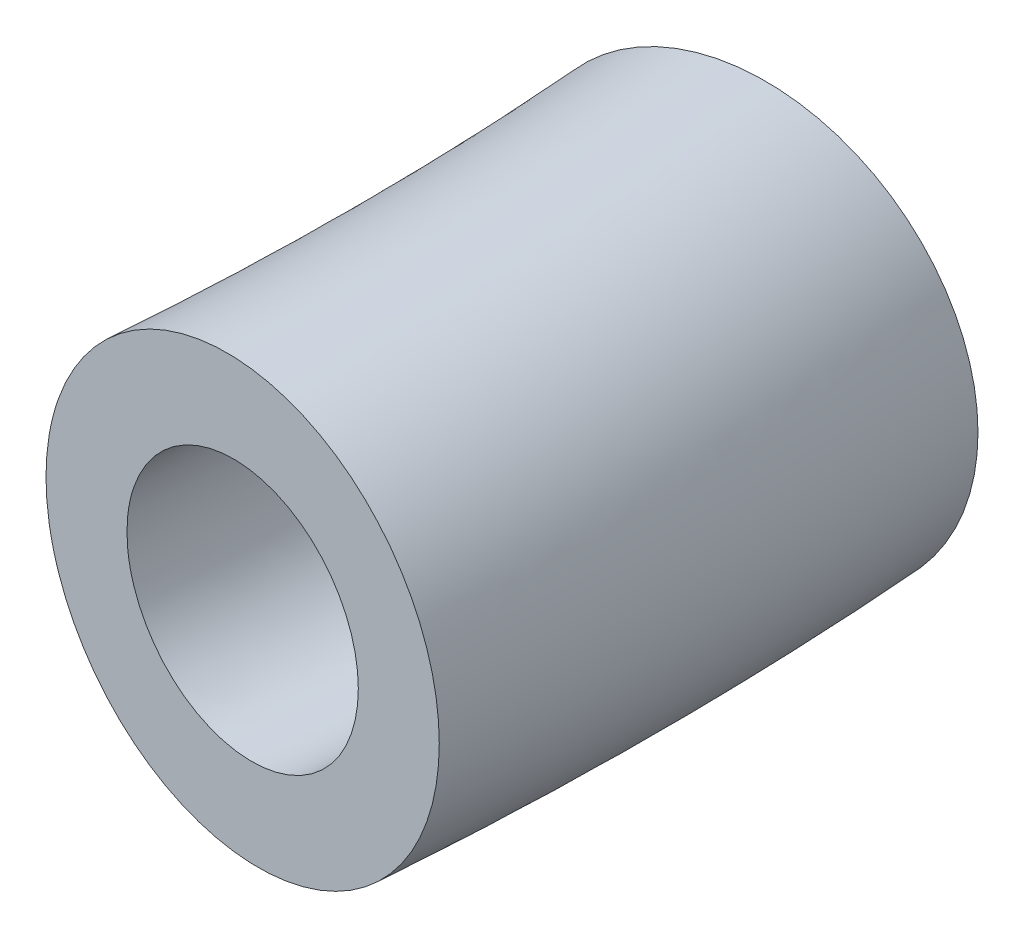
ISO-10303-21;
HEADER;
FILE_DESCRIPTION(('STEP AP214'),'2;1');
FILE_NAME('part.step','',(''),(''),'','','');
FILE_SCHEMA(('AUTOMOTIVE_DESIGN { 1 0 10303 214 1 1 1 1 }'));
ENDSEC;
DATA;
#1=APPLICATION_CONTEXT('core data for automotive mechanical design processes');
#2=APPLICATION_PROTOCOL_DEFINITION('international standard','automotive_design',2000,#1);
#3=PRODUCT_CONTEXT('',#1,'mechanical');
#4=PRODUCT('Part','Part','',(#3));
#5=PRODUCT_RELATED_PRODUCT_CATEGORY('part','',(#4));
#6=PRODUCT_DEFINITION_FORMATION('','',#4);
#7=PRODUCT_DEFINITION_CONTEXT('part definition',#1,'design');
#8=PRODUCT_DEFINITION('design','',#6,#7);
#9=PRODUCT_DEFINITION_SHAPE('','',#8);
#10=(LENGTH_UNIT() NAMED_UNIT(*) SI_UNIT(.MILLI.,.METRE.));
#11=(NAMED_UNIT(*) PLANE_ANGLE_UNIT() SI_UNIT($,.RADIAN.));
#12=(NAMED_UNIT(*) SI_UNIT($,.STERADIAN.) SOLID_ANGLE_UNIT());
#13=UNCERTAINTY_MEASURE_WITH_UNIT(LENGTH_MEASURE(1.E-05),#10,'distance_accuracy_value','');
#14=(GEOMETRIC_REPRESENTATION_CONTEXT(3) GLOBAL_UNCERTAINTY_ASSIGNED_CONTEXT((#13)) GLOBAL_UNIT_ASSIGNED_CONTEXT((#10,
#11,#12)) REPRESENTATION_CONTEXT('',''));
#15=CARTESIAN_POINT('',(0.,0.,0.));
#16=DIRECTION('',(0.,0.,1.));
#17=DIRECTION('',(1.,0.,0.));
#18=AXIS2_PLACEMENT_3D('',#15,#16,#17);
#19=CARTESIAN_POINT('',(40.3646493377853,0.,53.3891719470228));
#20=CARTESIAN_POINT('',(41.7877858495926,0.,35.5999655524769));
#21=CARTESIAN_POINT('',(42.5,0.,17.8000000000043));
#22=CARTESIAN_POINT('',(42.5,0.,-17.8000000000043));
#23=CARTESIAN_POINT('',(41.7877858493677,0.,-35.5999655522717));
#24=CARTESIAN_POINT('',(40.3646493377853,0.,-53.3891719470228));
#25=CARTESIAN_POINT('',(40.3646493377853,85.,53.3891719470228));
#26=CARTESIAN_POINT('',(41.7877858495926,85.,35.5999655524769));
#27=CARTESIAN_POINT('',(42.5,85.,17.8000000000043));
#28=CARTESIAN_POINT('',(42.5,85.,-17.8000000000043));
#29=CARTESIAN_POINT('',(41.7877858493677,85.,-35.5999655522717));
#30=CARTESIAN_POINT('',(40.3646493377853,85.,-53.3891719470228));
#31=CARTESIAN_POINT('',(-44.3646493377853,85.,46.6108280529772));
#32=CARTESIAN_POINT('',(-43.1211191826822,85.,31.0667011148847));
#33=CARTESIAN_POINT('',(-42.5,85.,15.5333333333406));
#34=CARTESIAN_POINT('',(-42.5,85.,-15.5333333333406));
#35=CARTESIAN_POINT('',(-43.121119182908,85.,-31.0667011144878));
#36=CARTESIAN_POINT('',(-44.3646493377853,85.,-46.6108280529772));
#37=CARTESIAN_POINT('',(-44.3646493377853,0.,46.6108280529772));
#38=CARTESIAN_POINT('',(-43.1211191826822,0.,31.0667011147977));
#39=CARTESIAN_POINT('',(-42.5,0.,15.5333333333406));
#40=CARTESIAN_POINT('',(-42.5,0.,-15.5333333333406));
#41=CARTESIAN_POINT('',(-43.121119182908,0.,-31.0667011144878));
#42=CARTESIAN_POINT('',(-44.3646493377853,0.,-46.6108280529772));
#43=CARTESIAN_POINT('',(-44.3646493377853,-85.,46.6108280529772));
#44=CARTESIAN_POINT('',(-43.1211191826822,-85.,31.0667011147107));
#45=CARTESIAN_POINT('',(-42.5,-85.,15.5333333333406));
#46=CARTESIAN_POINT('',(-42.5,-85.,-15.5333333333406));
#47=CARTESIAN_POINT('',(-43.121119182908,-85.,-31.0667011144878));
#48=CARTESIAN_POINT('',(-44.3646493377853,-85.,-46.6108280529772));
#49=CARTESIAN_POINT('',(40.3646493377853,-85.,53.3891719470228));
#50=CARTESIAN_POINT('',(41.7877858495926,-85.,35.5999655524769));
#51=CARTESIAN_POINT('',(42.5,-85.,17.8000000000043));
#52=CARTESIAN_POINT('',(42.5,-85.,-17.8000000000043));
#53=CARTESIAN_POINT('',(41.7877858493677,-85.,-35.5999655522717));
#54=CARTESIAN_POINT('',(40.3646493377853,-85.,-53.3891719470228));
#55=CARTESIAN_POINT('',(40.3646493377853,0.,53.3891719470228));
#56=CARTESIAN_POINT('',(41.7877858495926,0.,35.5999655524769));
#57=CARTESIAN_POINT('',(42.5,0.,17.8000000000043));
#58=CARTESIAN_POINT('',(42.5,0.,-17.8000000000043));
#59=CARTESIAN_POINT('',(41.7877858493677,0.,-35.5999655522717));
#60=CARTESIAN_POINT('',(40.3646493377853,0.,-53.3891719470228));
#61=(BOUNDED_SURFACE() B_SPLINE_SURFACE(3,3,((#19,#20,#21,#22,#23,#24),(#25,#26,#27,#28,#29,
#30),(#31,#32,#33,#34,#35,#36),(#37,#38,#39,#40,#41,#42),(#43,#44,#45,#46,#47,#48),(#49,#50,#51,
#52,#53,#54),(#55,#56,#57,#58,#59,#60)),.UNSPECIFIED.,.T.,.F.,
.F.) B_SPLINE_SURFACE_WITH_KNOTS((4,3,4),(4,2,4),(0.,0.5,1.),(0.,0.5,1.),
.UNSPECIFIED.) GEOMETRIC_REPRESENTATION_ITEM() RATIONAL_B_SPLINE_SURFACE(((1.,1.,1.,1.,1.,1.),
(0.333333333333333,0.333333333333333,0.333333333333333,0.333333333333333,0.333333333333333,
0.333333333333333),(0.333333333333333,0.333333333333333,0.333333333333333,0.333333333333333,
0.333333333333333,0.333333333333333),(1.,1.,1.,1.,1.,1.),(0.333333333333333,0.333333333333333,
0.333333333333333,0.333333333333333,0.333333333333333,0.333333333333333),(0.333333333333333,
0.333333333333333,0.333333333333333,0.333333333333333,0.333333333333333,0.333333333333333),(1.,
1.,1.,1.,1.,1.))) REPRESENTATION_ITEM('') SURFACE());
#62=CARTESIAN_POINT('',(-2.,0.,-50.));
#63=DIRECTION('',(0.0797452222828898,0.,0.996815278536125));
#64=DIRECTION('',(0.996815278536125,0.,-0.0797452222828898));
#65=AXIS2_PLACEMENT_3D('',#62,#63,#64);
#66=CIRCLE('',#65,42.5);
#67=CARTESIAN_POINT('',(40.3646493377853,0.,-53.3891719470228));
#68=VERTEX_POINT('',#67);
#69=EDGE_CURVE('E52',#68,#68,#66,.T.);
#70=CARTESIAN_POINT('',(-1.99999999999999,0.,50.));
#71=DIRECTION('',(-0.0797452222828898,0.,0.996815278536125));
#72=DIRECTION('',(0.996815278536125,0.,0.0797452222828898));
#73=AXIS2_PLACEMENT_3D('',#70,#71,#72);
#74=CIRCLE('',#73,42.5);
#75=CARTESIAN_POINT('',(40.3646493377853,0.,53.3891719470228));
#76=VERTEX_POINT('',#75);
#77=EDGE_CURVE('E37',#76,#76,#74,.T.);
#78=ORIENTED_EDGE('',*,*,#69,.T.);
#79=EDGE_LOOP('',(#78));
#80=FACE_BOUND('',#79,.T.);
#81=ORIENTED_EDGE('',*,*,#77,.F.);
#82=EDGE_LOOP('',(#81));
#83=FACE_BOUND('',#82,.T.);
#84=ADVANCED_FACE('F32',(#80,#83),#61,.F.);
#85=CARTESIAN_POINT('',(-1.99999999999999,0.,50.));
#86=DIRECTION('',(-0.0797452222828898,0.,0.996815278536125));
#87=DIRECTION('',(0.996815278536125,0.,0.0797452222828898));
#88=AXIS2_PLACEMENT_3D('',#85,#86,#87);
#89=PLANE('',#88);
#90=CARTESIAN_POINT('',(-1.99999999999999,0.,50.));
#91=DIRECTION('',(-0.0797452222828898,0.,0.996815278536125));
#92=DIRECTION('',(0.996815278536125,0.,0.0797452222828898));
#93=AXIS2_PLACEMENT_3D('',#90,#91,#92);
#94=CIRCLE('',#93,25.);
#95=CARTESIAN_POINT('',(22.9203819634031,0.,51.9936305570723));
#96=VERTEX_POINT('',#95);
#97=EDGE_CURVE('E42',#96,#96,#94,.F.);
#98=ORIENTED_EDGE('',*,*,#97,.T.);
#99=EDGE_LOOP('',(#98));
#100=FACE_BOUND('',#99,.T.);
#101=ORIENTED_EDGE('',*,*,#77,.T.);
#102=EDGE_LOOP('',(#101));
#103=FACE_BOUND('',#102,.T.);
#104=ADVANCED_FACE('F64',(#100,#103),#89,.T.);
#105=CARTESIAN_POINT('',(-2.,0.,-50.));
#106=DIRECTION('',(0.0797452222828898,0.,0.996815278536125));
#107=DIRECTION('',(0.996815278536125,0.,-0.0797452222828898));
#108=AXIS2_PLACEMENT_3D('',#105,#106,#107);
#109=PLANE('',#108);
#110=CARTESIAN_POINT('',(-2.,0.,-50.));
#111=DIRECTION('',(0.0797452222828898,0.,0.996815278536125));
#112=DIRECTION('',(0.996815278536125,0.,-0.0797452222828898));
#113=AXIS2_PLACEMENT_3D('',#110,#111,#112);
#114=CIRCLE('',#113,25.);
#115=CARTESIAN_POINT('',(22.9203819634031,0.,-51.9936305570723));
#116=VERTEX_POINT('',#115);
#117=EDGE_CURVE('E11',#116,#116,#114,.F.);
#118=ORIENTED_EDGE('',*,*,#117,.F.);
#119=EDGE_LOOP('',(#118));
#120=FACE_BOUND('',#119,.T.);
#121=ORIENTED_EDGE('',*,*,#69,.F.);
#122=EDGE_LOOP('',(#121));
#123=FACE_BOUND('',#122,.T.);
#124=ADVANCED_FACE('F62',(#120,#123),#109,.F.);
#125=CARTESIAN_POINT('',(22.9203819634031,0.,51.9936305570723));
#126=CARTESIAN_POINT('',(24.3065406956638,0.,34.6666464034952));
#127=CARTESIAN_POINT('',(25.,0.,17.3333333333383));
#128=CARTESIAN_POINT('',(25.,0.,-17.3333333333383));
#129=CARTESIAN_POINT('',(24.3065406956707,0.,-34.6666464032343));
#130=CARTESIAN_POINT('',(22.9203819634031,0.,-51.9936305570723));
#131=CARTESIAN_POINT('',(22.9203819634031,-50.,51.9936305570723));
#132=CARTESIAN_POINT('',(24.3065406956638,-50.,34.6666464034952));
#133=CARTESIAN_POINT('',(25.,-50.,17.3333333333383));
#134=CARTESIAN_POINT('',(25.,-50.,-17.3333333333383));
#135=CARTESIAN_POINT('',(24.3065406956707,-50.,-34.6666464032343));
#136=CARTESIAN_POINT('',(22.9203819634031,-50.,-51.9936305570723));
#137=CARTESIAN_POINT('',(-26.9203819634031,-50.,48.0063694429278));
#138=CARTESIAN_POINT('',(-25.6398740289854,-50.,32.0000202637794));
#139=CARTESIAN_POINT('',(-25.,-50.,16.0000000000066));
#140=CARTESIAN_POINT('',(-25.,-50.,-16.0000000000066));
#141=CARTESIAN_POINT('',(-25.639874028979,-50.,-32.0000202635252));
#142=CARTESIAN_POINT('',(-26.9203819634031,-50.,-48.0063694429278));
#143=CARTESIAN_POINT('',(-26.9203819634031,0.,48.0063694429278));
#144=CARTESIAN_POINT('',(-25.6398740289854,0.,32.0000202637794));
#145=CARTESIAN_POINT('',(-25.,0.,16.0000000000066));
#146=CARTESIAN_POINT('',(-25.,0.,-16.0000000000066));
#147=CARTESIAN_POINT('',(-25.639874028979,0.,-32.0000202635252));
#148=CARTESIAN_POINT('',(-26.9203819634031,0.,-48.0063694429278));
#149=CARTESIAN_POINT('',(-26.9203819634031,50.,48.0063694429278));
#150=CARTESIAN_POINT('',(-25.6398740289854,50.,32.0000202637794));
#151=CARTESIAN_POINT('',(-25.,50.,16.0000000000066));
#152=CARTESIAN_POINT('',(-25.,50.,-16.0000000000066));
#153=CARTESIAN_POINT('',(-25.639874028979,50.,-32.0000202635252));
#154=CARTESIAN_POINT('',(-26.9203819634031,50.,-48.0063694429278));
#155=CARTESIAN_POINT('',(22.9203819634031,50.,51.9936305570723));
#156=CARTESIAN_POINT('',(24.3065406956638,50.,34.6666464034952));
#157=CARTESIAN_POINT('',(25.,50.,17.3333333333383));
#158=CARTESIAN_POINT('',(25.,50.,-17.3333333333383));
#159=CARTESIAN_POINT('',(24.3065406956707,50.,-34.6666464032343));
#160=CARTESIAN_POINT('',(22.9203819634031,50.,-51.9936305570723));
#161=CARTESIAN_POINT('',(22.9203819634031,0.,51.9936305570723));
#162=CARTESIAN_POINT('',(24.3065406956638,0.,34.6666464034952));
#163=CARTESIAN_POINT('',(25.,0.,17.3333333333383));
#164=CARTESIAN_POINT('',(25.,0.,-17.3333333333383));
#165=CARTESIAN_POINT('',(24.3065406956707,0.,-34.6666464032343));
#166=CARTESIAN_POINT('',(22.9203819634031,0.,-51.9936305570723));
#167=(BOUNDED_SURFACE() B_SPLINE_SURFACE(3,3,((#125,#126,#127,#128,#129,#130),(#131,#132,#133,
#134,#135,#136),(#137,#138,#139,#140,#141,#142),(#143,#144,#145,#146,#147,#148),(#149,#150,#151,
#152,#153,#154),(#155,#156,#157,#158,#159,#160),(#161,#162,#163,#164,#165,#166)),.UNSPECIFIED.,
.T.,.F.,.F.) B_SPLINE_SURFACE_WITH_KNOTS((4,3,4),(4,2,4),(0.,0.5,1.),(0.,0.5,1.),
.UNSPECIFIED.) GEOMETRIC_REPRESENTATION_ITEM() RATIONAL_B_SPLINE_SURFACE(((1.,1.,1.,1.,1.,1.),
(0.333333333333333,0.333333333333333,0.333333333333333,0.333333333333333,0.333333333333333,
0.333333333333333),(0.333333333333333,0.333333333333333,0.333333333333333,0.333333333333333,
0.333333333333333,0.333333333333333),(1.,1.,1.,1.,1.,1.),(0.333333333333333,0.333333333333333,
0.333333333333333,0.333333333333333,0.333333333333333,0.333333333333333),(0.333333333333333,
0.333333333333333,0.333333333333333,0.333333333333333,0.333333333333333,0.333333333333333),(1.,
1.,1.,1.,1.,1.))) REPRESENTATION_ITEM('') SURFACE());
#168=ORIENTED_EDGE('',*,*,#117,.T.);
#169=EDGE_LOOP('',(#168));
#170=FACE_BOUND('',#169,.T.);
#171=ORIENTED_EDGE('',*,*,#97,.F.);
#172=EDGE_LOOP('',(#171));
#173=FACE_BOUND('',#172,.T.);
#174=ADVANCED_FACE('F59',(#170,#173),#167,.F.);
#175=CLOSED_SHELL('',(#84,#104,#124,#174));
#176=MANIFOLD_SOLID_BREP('B2',#175);
#177=ADVANCED_BREP_SHAPE_REPRESENTATION('',(#18,#176),#14);
#178=SHAPE_DEFINITION_REPRESENTATION(#9,#177);
ENDSEC;
END-ISO-10303-21;
